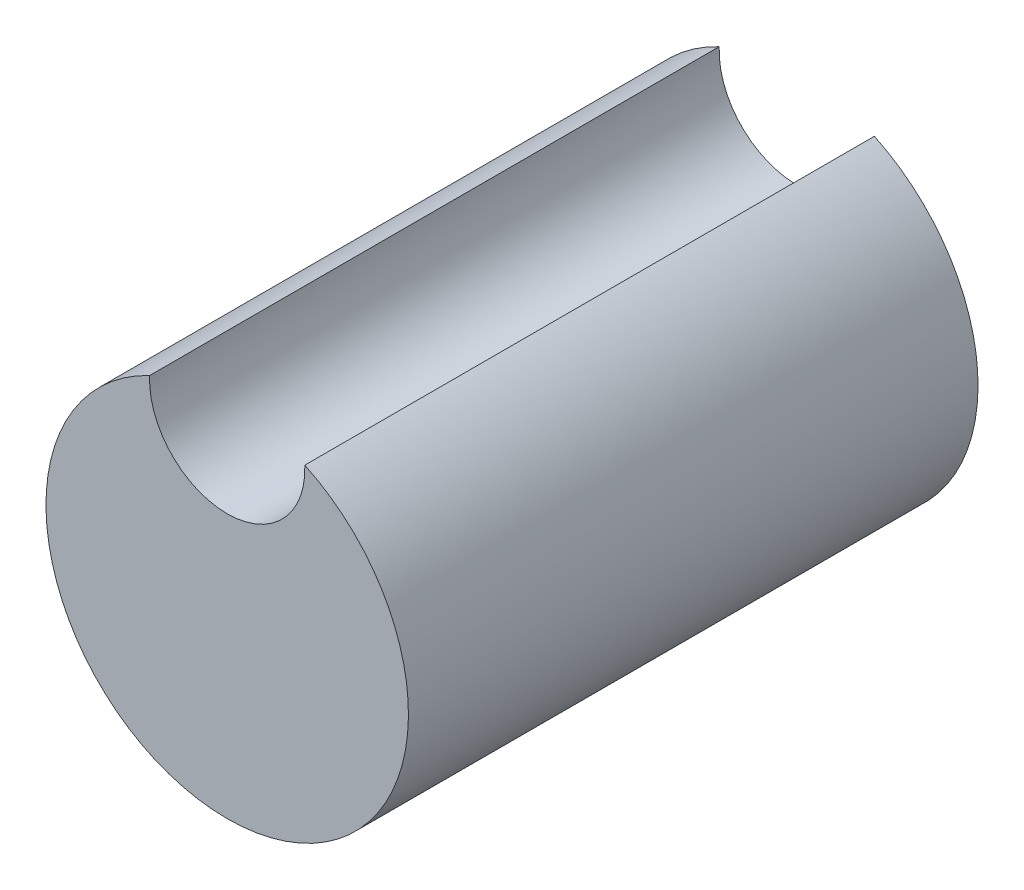
ISO-10303-21;
HEADER;
FILE_DESCRIPTION(('STEP AP214'),'2;1');
FILE_NAME('part.step','',(''),(''),'','','');
FILE_SCHEMA(('AUTOMOTIVE_DESIGN { 1 0 10303 214 1 1 1 1 }'));
ENDSEC;
DATA;
#1=APPLICATION_CONTEXT('core data for automotive mechanical design processes');
#2=APPLICATION_PROTOCOL_DEFINITION('international standard','automotive_design',2000,#1);
#3=PRODUCT_CONTEXT('',#1,'mechanical');
#4=PRODUCT('Part','Part','',(#3));
#5=PRODUCT_RELATED_PRODUCT_CATEGORY('part','',(#4));
#6=PRODUCT_DEFINITION_FORMATION('','',#4);
#7=PRODUCT_DEFINITION_CONTEXT('part definition',#1,'design');
#8=PRODUCT_DEFINITION('design','',#6,#7);
#9=PRODUCT_DEFINITION_SHAPE('','',#8);
#10=(LENGTH_UNIT() NAMED_UNIT(*) SI_UNIT(.MILLI.,.METRE.));
#11=(NAMED_UNIT(*) PLANE_ANGLE_UNIT() SI_UNIT($,.RADIAN.));
#12=(NAMED_UNIT(*) SI_UNIT($,.STERADIAN.) SOLID_ANGLE_UNIT());
#13=UNCERTAINTY_MEASURE_WITH_UNIT(LENGTH_MEASURE(1.E-05),#10,'distance_accuracy_value','');
#14=(GEOMETRIC_REPRESENTATION_CONTEXT(3) GLOBAL_UNCERTAINTY_ASSIGNED_CONTEXT((#13)) GLOBAL_UNIT_ASSIGNED_CONTEXT((#10,
#11,#12)) REPRESENTATION_CONTEXT('',''));
#15=CARTESIAN_POINT('',(0.,0.,0.));
#16=DIRECTION('',(0.,0.,1.));
#17=DIRECTION('',(1.,0.,0.));
#18=AXIS2_PLACEMENT_3D('',#15,#16,#17);
#19=CARTESIAN_POINT('',(0.,0.,55.));
#20=DIRECTION('',(0.,0.,-1.));
#21=DIRECTION('',(-1.,0.,0.));
#22=AXIS2_PLACEMENT_3D('',#19,#20,#21);
#23=CYLINDRICAL_SURFACE('',#22,17.5);
#24=CARTESIAN_POINT('',(0.,0.,0.));
#25=DIRECTION('',(0.,0.,1.));
#26=DIRECTION('',(1.,0.,0.));
#27=AXIS2_PLACEMENT_3D('',#24,#25,#26);
#28=CIRCLE('',#27,17.5);
#29=CARTESIAN_POINT('',(-7.49340240508799,15.8145161290323,0.));
#30=VERTEX_POINT('',#29);
#31=CARTESIAN_POINT('',(7.49340240508799,15.8145161290323,0.));
#32=VERTEX_POINT('',#31);
#33=EDGE_CURVE('E34',#30,#32,#28,.T.);
#34=ORIENTED_EDGE('',*,*,#33,.T.);
#35=DIRECTION('',(0.,0.,-1.));
#36=VECTOR('',#35,1.);
#37=CARTESIAN_POINT('',(7.49340240508799,15.8145161290323,27.5));
#38=LINE('',#37,#36);
#39=CARTESIAN_POINT('',(7.493402405088,15.8145161290323,55.));
#40=VERTEX_POINT('',#39);
#41=EDGE_CURVE('E45',#40,#32,#38,.T.);
#42=ORIENTED_EDGE('',*,*,#41,.F.);
#43=CARTESIAN_POINT('',(0.,0.,55.));
#44=DIRECTION('',(0.,0.,1.));
#45=DIRECTION('',(1.,0.,0.));
#46=AXIS2_PLACEMENT_3D('',#43,#44,#45);
#47=CIRCLE('',#46,17.5);
#48=CARTESIAN_POINT('',(-7.493402405088,15.8145161290323,55.));
#49=VERTEX_POINT('',#48);
#50=EDGE_CURVE('E11',#49,#40,#47,.T.);
#51=ORIENTED_EDGE('',*,*,#50,.F.);
#52=DIRECTION('',(0.,0.,-1.));
#53=VECTOR('',#52,1.);
#54=CARTESIAN_POINT('',(-7.49340240508799,15.8145161290323,27.5));
#55=LINE('',#54,#53);
#56=EDGE_CURVE('E57',#30,#49,#55,.F.);
#57=ORIENTED_EDGE('',*,*,#56,.F.);
#58=EDGE_LOOP('',(#34,#42,#51,#57));
#59=FACE_BOUND('',#58,.T.);
#60=ADVANCED_FACE('F31',(#59),#23,.T.);
#61=CARTESIAN_POINT('',(0.,0.,55.));
#62=DIRECTION('',(0.,0.,1.));
#63=DIRECTION('',(1.,0.,0.));
#64=AXIS2_PLACEMENT_3D('',#61,#62,#63);
#65=PLANE('',#64);
#66=CARTESIAN_POINT('',(0.,15.5,55.));
#67=DIRECTION('',(0.,0.,1.));
#68=DIRECTION('',(1.,0.,0.));
#69=AXIS2_PLACEMENT_3D('',#66,#67,#68);
#70=CIRCLE('',#69,7.5);
#71=EDGE_CURVE('E55',#49,#40,#70,.T.);
#72=ORIENTED_EDGE('',*,*,#71,.F.);
#73=ORIENTED_EDGE('',*,*,#50,.T.);
#74=EDGE_LOOP('',(#72,#73));
#75=FACE_BOUND('',#74,.T.);
#76=ADVANCED_FACE('F65',(#75),#65,.T.);
#77=CARTESIAN_POINT('',(0.,0.,0.));
#78=DIRECTION('',(0.,0.,1.));
#79=DIRECTION('',(1.,0.,0.));
#80=AXIS2_PLACEMENT_3D('',#77,#78,#79);
#81=PLANE('',#80);
#82=ORIENTED_EDGE('',*,*,#33,.F.);
#83=CARTESIAN_POINT('',(0.,15.5,0.));
#84=DIRECTION('',(0.,0.,1.));
#85=DIRECTION('',(1.,0.,0.));
#86=AXIS2_PLACEMENT_3D('',#83,#84,#85);
#87=CIRCLE('',#86,7.5);
#88=EDGE_CURVE('E49',#32,#30,#87,.F.);
#89=ORIENTED_EDGE('',*,*,#88,.F.);
#90=EDGE_LOOP('',(#82,#89));
#91=FACE_BOUND('',#90,.T.);
#92=ADVANCED_FACE('F67',(#91),#81,.F.);
#93=CARTESIAN_POINT('',(0.,15.5,-0.001000000000001));
#94=DIRECTION('',(0.,0.,1.));
#95=DIRECTION('',(1.,0.,0.));
#96=AXIS2_PLACEMENT_3D('',#93,#94,#95);
#97=CYLINDRICAL_SURFACE('',#96,7.5);
#98=ORIENTED_EDGE('',*,*,#41,.T.);
#99=ORIENTED_EDGE('',*,*,#88,.T.);
#100=ORIENTED_EDGE('',*,*,#56,.T.);
#101=ORIENTED_EDGE('',*,*,#71,.T.);
#102=EDGE_LOOP('',(#98,#99,#100,#101));
#103=FACE_BOUND('',#102,.T.);
#104=ADVANCED_FACE('F56',(#103),#97,.F.);
#105=CLOSED_SHELL('',(#60,#76,#92,#104));
#106=MANIFOLD_SOLID_BREP('B2',#105);
#107=ADVANCED_BREP_SHAPE_REPRESENTATION('',(#18,#106),#14);
#108=SHAPE_DEFINITION_REPRESENTATION(#9,#107);
ENDSEC;
END-ISO-10303-21;
